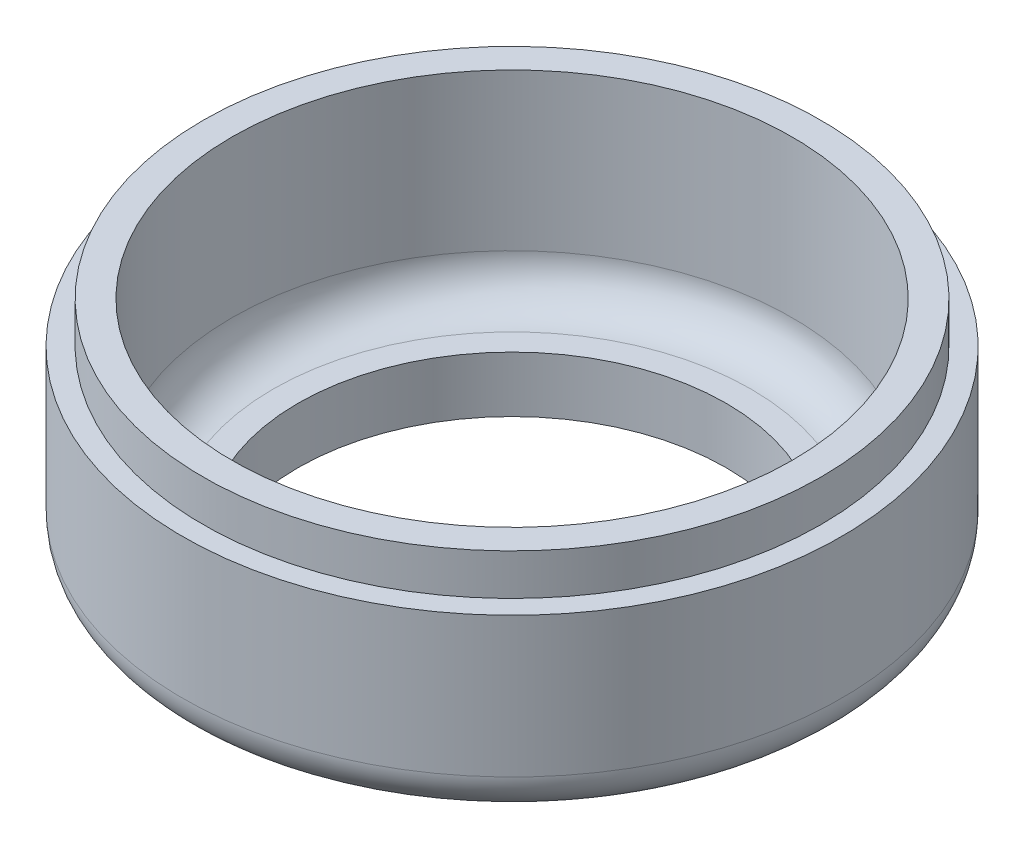
ISO-10303-21;
HEADER;
FILE_DESCRIPTION(('STEP AP214'),'2;1');
FILE_NAME('part.step','',(''),(''),'','','');
FILE_SCHEMA(('AUTOMOTIVE_DESIGN { 1 0 10303 214 1 1 1 1 }'));
ENDSEC;
DATA;
#1=APPLICATION_CONTEXT('core data for automotive mechanical design processes');
#2=APPLICATION_PROTOCOL_DEFINITION('international standard','automotive_design',2000,#1);
#3=PRODUCT_CONTEXT('',#1,'mechanical');
#4=PRODUCT('Part','Part','',(#3));
#5=PRODUCT_RELATED_PRODUCT_CATEGORY('part','',(#4));
#6=PRODUCT_DEFINITION_FORMATION('','',#4);
#7=PRODUCT_DEFINITION_CONTEXT('part definition',#1,'design');
#8=PRODUCT_DEFINITION('design','',#6,#7);
#9=PRODUCT_DEFINITION_SHAPE('','',#8);
#10=(LENGTH_UNIT() NAMED_UNIT(*) SI_UNIT(.MILLI.,.METRE.));
#11=(NAMED_UNIT(*) PLANE_ANGLE_UNIT() SI_UNIT($,.RADIAN.));
#12=(NAMED_UNIT(*) SI_UNIT($,.STERADIAN.) SOLID_ANGLE_UNIT());
#13=UNCERTAINTY_MEASURE_WITH_UNIT(LENGTH_MEASURE(1.E-05),#10,'distance_accuracy_value','');
#14=(GEOMETRIC_REPRESENTATION_CONTEXT(3) GLOBAL_UNCERTAINTY_ASSIGNED_CONTEXT((#13)) GLOBAL_UNIT_ASSIGNED_CONTEXT((#10,
#11,#12)) REPRESENTATION_CONTEXT('',''));
#15=CARTESIAN_POINT('',(0.,0.,0.));
#16=DIRECTION('',(0.,0.,1.));
#17=DIRECTION('',(1.,0.,0.));
#18=AXIS2_PLACEMENT_3D('',#15,#16,#17);
#19=CARTESIAN_POINT('',(-37.5,13.7969814100788,0.));
#20=DIRECTION('',(0.,1.,0.));
#21=DIRECTION('',(-1.,0.,0.));
#22=AXIS2_PLACEMENT_3D('',#19,#20,#21);
#23=PLANE('',#22);
#24=CARTESIAN_POINT('',(0.,13.7969814100788,0.));
#25=DIRECTION('',(0.,1.,0.));
#26=DIRECTION('',(-1.,0.,0.));
#27=AXIS2_PLACEMENT_3D('',#24,#25,#26);
#28=CIRCLE('',#27,37.5);
#29=CARTESIAN_POINT('',(-37.5,13.7969814100788,0.));
#30=VERTEX_POINT('',#29);
#31=EDGE_CURVE('E10',#30,#30,#28,.T.);
#32=ORIENTED_EDGE('',*,*,#31,.T.);
#33=EDGE_LOOP('',(#32));
#34=FACE_BOUND('',#33,.T.);
#35=CARTESIAN_POINT('',(0.,13.7969814100788,0.));
#36=DIRECTION('',(0.,1.,0.));
#37=DIRECTION('',(-1.,0.,0.));
#38=AXIS2_PLACEMENT_3D('',#35,#36,#37);
#39=CIRCLE('',#38,34.);
#40=CARTESIAN_POINT('',(-34.,13.7969814100788,0.));
#41=VERTEX_POINT('',#40);
#42=EDGE_CURVE('E71',#41,#41,#39,.T.);
#43=ORIENTED_EDGE('',*,*,#42,.F.);
#44=EDGE_LOOP('',(#43));
#45=FACE_BOUND('',#44,.T.);
#46=ADVANCED_FACE('F31',(#34,#45),#23,.T.);
#47=CARTESIAN_POINT('',(0.,133.043372469137,0.));
#48=DIRECTION('',(0.,1.,0.));
#49=DIRECTION('',(-1.,0.,0.));
#50=AXIS2_PLACEMENT_3D('',#47,#48,#49);
#51=CYLINDRICAL_SURFACE('',#50,37.5);
#52=CARTESIAN_POINT('',(0.,8.79698141007881,0.));
#53=DIRECTION('',(0.,1.,0.));
#54=DIRECTION('',(-1.,0.,0.));
#55=AXIS2_PLACEMENT_3D('',#52,#53,#54);
#56=CIRCLE('',#55,37.5);
#57=CARTESIAN_POINT('',(-37.5,8.7969814100788,0.));
#58=VERTEX_POINT('',#57);
#59=EDGE_CURVE('E37',#58,#58,#56,.T.);
#60=ORIENTED_EDGE('',*,*,#59,.T.);
#61=EDGE_LOOP('',(#60));
#62=FACE_BOUND('',#61,.T.);
#63=ORIENTED_EDGE('',*,*,#31,.F.);
#64=EDGE_LOOP('',(#63));
#65=FACE_BOUND('',#64,.T.);
#66=ADVANCED_FACE('F79',(#62,#65),#51,.T.);
#67=CARTESIAN_POINT('',(-37.5,8.7969814100788,0.));
#68=DIRECTION('',(0.,1.,0.));
#69=DIRECTION('',(-1.,0.,0.));
#70=AXIS2_PLACEMENT_3D('',#67,#68,#69);
#71=PLANE('',#70);
#72=CARTESIAN_POINT('',(0.,8.79698141007881,0.));
#73=DIRECTION('',(0.,1.,0.));
#74=DIRECTION('',(-1.,0.,0.));
#75=AXIS2_PLACEMENT_3D('',#72,#73,#74);
#76=CIRCLE('',#75,40.);
#77=CARTESIAN_POINT('',(-40.,8.7969814100788,0.));
#78=VERTEX_POINT('',#77);
#79=EDGE_CURVE('E41',#78,#78,#76,.T.);
#80=ORIENTED_EDGE('',*,*,#79,.T.);
#81=EDGE_LOOP('',(#80));
#82=FACE_BOUND('',#81,.T.);
#83=ORIENTED_EDGE('',*,*,#59,.F.);
#84=EDGE_LOOP('',(#83));
#85=FACE_BOUND('',#84,.T.);
#86=ADVANCED_FACE('F83',(#82,#85),#71,.T.);
#87=CARTESIAN_POINT('',(0.,133.043372469137,0.));
#88=DIRECTION('',(0.,1.,0.));
#89=DIRECTION('',(-1.,0.,0.));
#90=AXIS2_PLACEMENT_3D('',#87,#88,#89);
#91=CYLINDRICAL_SURFACE('',#90,40.);
#92=CARTESIAN_POINT('',(0.,-8.2030185899212,0.));
#93=DIRECTION('',(0.,1.,0.));
#94=DIRECTION('',(-1.,0.,0.));
#95=AXIS2_PLACEMENT_3D('',#92,#93,#94);
#96=CIRCLE('',#95,40.);
#97=CARTESIAN_POINT('',(-40.,-8.20301858992121,0.));
#98=VERTEX_POINT('',#97);
#99=EDGE_CURVE('E45',#98,#98,#96,.T.);
#100=ORIENTED_EDGE('',*,*,#99,.T.);
#101=EDGE_LOOP('',(#100));
#102=FACE_BOUND('',#101,.T.);
#103=ORIENTED_EDGE('',*,*,#79,.F.);
#104=EDGE_LOOP('',(#103));
#105=FACE_BOUND('',#104,.T.);
#106=ADVANCED_FACE('F87',(#102,#105),#91,.T.);
#107=CARTESIAN_POINT('',(0.,-8.20301858992119,0.));
#108=DIRECTION('',(0.,1.,0.));
#109=DIRECTION('',(-1.,0.,0.));
#110=AXIS2_PLACEMENT_3D('',#107,#108,#109);
#111=TOROIDAL_SURFACE('',#110,35.,5.);
#112=CARTESIAN_POINT('',(0.,-13.2030185899212,0.));
#113=DIRECTION('',(0.,1.,0.));
#114=DIRECTION('',(-1.,0.,0.));
#115=AXIS2_PLACEMENT_3D('',#112,#113,#114);
#116=CIRCLE('',#115,35.);
#117=CARTESIAN_POINT('',(-35.,-13.2030185899212,0.));
#118=VERTEX_POINT('',#117);
#119=EDGE_CURVE('E50',#118,#118,#116,.T.);
#120=ORIENTED_EDGE('',*,*,#119,.T.);
#121=EDGE_LOOP('',(#120));
#122=FACE_BOUND('',#121,.T.);
#123=ORIENTED_EDGE('',*,*,#99,.F.);
#124=EDGE_LOOP('',(#123));
#125=FACE_BOUND('',#124,.T.);
#126=ADVANCED_FACE('F94',(#122,#125),#111,.T.);
#127=CARTESIAN_POINT('',(-35.,-13.2030185899212,0.));
#128=DIRECTION('',(0.,-1.,0.));
#129=DIRECTION('',(1.,0.,0.));
#130=AXIS2_PLACEMENT_3D('',#127,#128,#129);
#131=PLANE('',#130);
#132=CARTESIAN_POINT('',(0.,-13.2030185899212,0.));
#133=DIRECTION('',(0.,1.,0.));
#134=DIRECTION('',(-1.,0.,0.));
#135=AXIS2_PLACEMENT_3D('',#132,#133,#134);
#136=CIRCLE('',#135,29.);
#137=CARTESIAN_POINT('',(-29.,-13.2030185899212,0.));
#138=VERTEX_POINT('',#137);
#139=EDGE_CURVE('E53',#138,#138,#136,.T.);
#140=ORIENTED_EDGE('',*,*,#139,.T.);
#141=EDGE_LOOP('',(#140));
#142=FACE_BOUND('',#141,.T.);
#143=ORIENTED_EDGE('',*,*,#119,.F.);
#144=EDGE_LOOP('',(#143));
#145=FACE_BOUND('',#144,.T.);
#146=ADVANCED_FACE('F98',(#142,#145),#131,.T.);
#147=CARTESIAN_POINT('',(0.,133.043372469137,0.));
#148=DIRECTION('',(0.,1.,0.));
#149=DIRECTION('',(-1.,0.,0.));
#150=AXIS2_PLACEMENT_3D('',#147,#148,#149);
#151=CYLINDRICAL_SURFACE('',#150,29.);
#152=CARTESIAN_POINT('',(0.,-16.9802596281431,0.));
#153=DIRECTION('',(0.,1.,0.));
#154=DIRECTION('',(-1.,0.,0.));
#155=AXIS2_PLACEMENT_3D('',#152,#153,#154);
#156=CIRCLE('',#155,29.);
#157=CARTESIAN_POINT('',(-29.,-16.9802596281431,0.));
#158=VERTEX_POINT('',#157);
#159=EDGE_CURVE('E56',#158,#158,#156,.T.);
#160=ORIENTED_EDGE('',*,*,#159,.T.);
#161=EDGE_LOOP('',(#160));
#162=FACE_BOUND('',#161,.T.);
#163=ORIENTED_EDGE('',*,*,#139,.F.);
#164=EDGE_LOOP('',(#163));
#165=FACE_BOUND('',#164,.T.);
#166=ADVANCED_FACE('F102',(#162,#165),#151,.T.);
#167=CARTESIAN_POINT('',(-29.,-16.9802596281431,0.));
#168=DIRECTION('',(0.,-1.,0.));
#169=DIRECTION('',(1.,0.,0.));
#170=AXIS2_PLACEMENT_3D('',#167,#168,#169);
#171=PLANE('',#170);
#172=CARTESIAN_POINT('',(0.,-16.9802596281431,0.));
#173=DIRECTION('',(0.,1.,0.));
#174=DIRECTION('',(-1.,0.,0.));
#175=AXIS2_PLACEMENT_3D('',#172,#173,#174);
#176=CIRCLE('',#175,26.);
#177=CARTESIAN_POINT('',(-26.,-16.9802596281431,0.));
#178=VERTEX_POINT('',#177);
#179=EDGE_CURVE('E59',#178,#178,#176,.T.);
#180=ORIENTED_EDGE('',*,*,#179,.T.);
#181=EDGE_LOOP('',(#180));
#182=FACE_BOUND('',#181,.T.);
#183=ORIENTED_EDGE('',*,*,#159,.F.);
#184=EDGE_LOOP('',(#183));
#185=FACE_BOUND('',#184,.T.);
#186=ADVANCED_FACE('F106',(#182,#185),#171,.T.);
#187=CARTESIAN_POINT('',(0.,133.043372469137,0.));
#188=DIRECTION('',(0.,1.,0.));
#189=DIRECTION('',(-1.,0.,0.));
#190=AXIS2_PLACEMENT_3D('',#187,#188,#189);
#191=CYLINDRICAL_SURFACE('',#190,26.);
#192=CARTESIAN_POINT('',(0.,-10.2030185899212,0.));
#193=DIRECTION('',(0.,1.,0.));
#194=DIRECTION('',(-1.,0.,0.));
#195=AXIS2_PLACEMENT_3D('',#192,#193,#194);
#196=CIRCLE('',#195,26.);
#197=CARTESIAN_POINT('',(-26.,-10.2030185899212,0.));
#198=VERTEX_POINT('',#197);
#199=EDGE_CURVE('E62',#198,#198,#196,.T.);
#200=ORIENTED_EDGE('',*,*,#199,.T.);
#201=EDGE_LOOP('',(#200));
#202=FACE_BOUND('',#201,.T.);
#203=ORIENTED_EDGE('',*,*,#179,.F.);
#204=EDGE_LOOP('',(#203));
#205=FACE_BOUND('',#204,.T.);
#206=ADVANCED_FACE('F110',(#202,#205),#191,.F.);
#207=CARTESIAN_POINT('',(-29.,-10.2030185899212,0.));
#208=DIRECTION('',(0.,1.,0.));
#209=DIRECTION('',(-1.,0.,0.));
#210=AXIS2_PLACEMENT_3D('',#207,#208,#209);
#211=PLANE('',#210);
#212=CARTESIAN_POINT('',(0.,-10.2030185899212,0.));
#213=DIRECTION('',(0.,1.,0.));
#214=DIRECTION('',(-1.,0.,0.));
#215=AXIS2_PLACEMENT_3D('',#212,#213,#214);
#216=CIRCLE('',#215,29.);
#217=CARTESIAN_POINT('',(-29.,-10.2030185899212,0.));
#218=VERTEX_POINT('',#217);
#219=EDGE_CURVE('E65',#218,#218,#216,.T.);
#220=ORIENTED_EDGE('',*,*,#219,.T.);
#221=EDGE_LOOP('',(#220));
#222=FACE_BOUND('',#221,.T.);
#223=ORIENTED_EDGE('',*,*,#199,.F.);
#224=EDGE_LOOP('',(#223));
#225=FACE_BOUND('',#224,.T.);
#226=ADVANCED_FACE('F114',(#222,#225),#211,.T.);
#227=CARTESIAN_POINT('',(0.,-5.2030185899212,0.));
#228=DIRECTION('',(0.,1.,0.));
#229=DIRECTION('',(-1.,0.,0.));
#230=AXIS2_PLACEMENT_3D('',#227,#228,#229);
#231=TOROIDAL_SURFACE('',#230,29.,5.);
#232=CARTESIAN_POINT('',(0.,-5.2030185899212,0.));
#233=DIRECTION('',(0.,1.,0.));
#234=DIRECTION('',(-1.,0.,0.));
#235=AXIS2_PLACEMENT_3D('',#232,#233,#234);
#236=CIRCLE('',#235,34.);
#237=CARTESIAN_POINT('',(-34.,-5.20301858992121,0.));
#238=VERTEX_POINT('',#237);
#239=EDGE_CURVE('E68',#238,#238,#236,.T.);
#240=ORIENTED_EDGE('',*,*,#239,.T.);
#241=EDGE_LOOP('',(#240));
#242=FACE_BOUND('',#241,.T.);
#243=ORIENTED_EDGE('',*,*,#219,.F.);
#244=EDGE_LOOP('',(#243));
#245=FACE_BOUND('',#244,.T.);
#246=ADVANCED_FACE('F118',(#242,#245),#231,.F.);
#247=CARTESIAN_POINT('',(0.,133.043372469137,0.));
#248=DIRECTION('',(0.,1.,0.));
#249=DIRECTION('',(-1.,0.,0.));
#250=AXIS2_PLACEMENT_3D('',#247,#248,#249);
#251=CYLINDRICAL_SURFACE('',#250,34.);
#252=ORIENTED_EDGE('',*,*,#42,.T.);
#253=EDGE_LOOP('',(#252));
#254=FACE_BOUND('',#253,.T.);
#255=ORIENTED_EDGE('',*,*,#239,.F.);
#256=EDGE_LOOP('',(#255));
#257=FACE_BOUND('',#256,.T.);
#258=ADVANCED_FACE('F75',(#254,#257),#251,.F.);
#259=CLOSED_SHELL('',(#46,#66,#86,#106,#126,#146,#166,#186,#206,#226,#246,#258));
#260=MANIFOLD_SOLID_BREP('B2',#259);
#261=ADVANCED_BREP_SHAPE_REPRESENTATION('',(#18,#260),#14);
#262=SHAPE_DEFINITION_REPRESENTATION(#9,#261);
ENDSEC;
END-ISO-10303-21;
